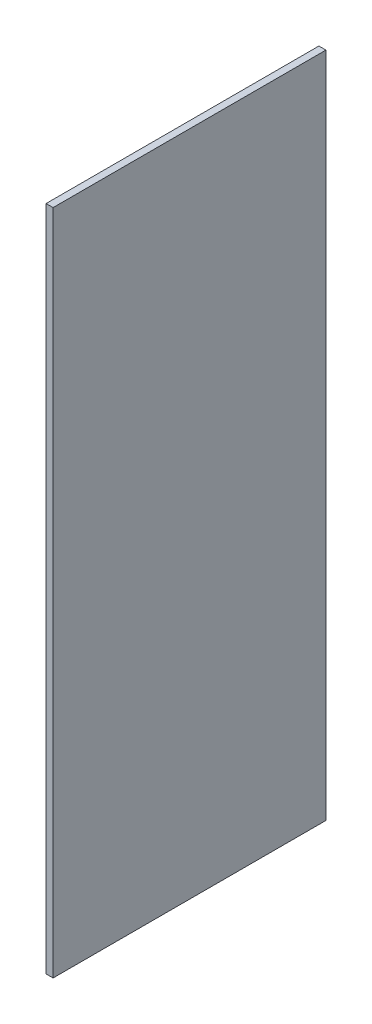
ISO-10303-21;
HEADER;
FILE_DESCRIPTION(('STEP AP214'),'2;1');
FILE_NAME('part.step','',(''),(''),'','','');
FILE_SCHEMA(('AUTOMOTIVE_DESIGN { 1 0 10303 214 1 1 1 1 }'));
ENDSEC;
DATA;
#1=APPLICATION_CONTEXT('core data for automotive mechanical design processes');
#2=APPLICATION_PROTOCOL_DEFINITION('international standard','automotive_design',2000,#1);
#3=PRODUCT_CONTEXT('',#1,'mechanical');
#4=PRODUCT('Part','Part','',(#3));
#5=PRODUCT_RELATED_PRODUCT_CATEGORY('part','',(#4));
#6=PRODUCT_DEFINITION_FORMATION('','',#4);
#7=PRODUCT_DEFINITION_CONTEXT('part definition',#1,'design');
#8=PRODUCT_DEFINITION('design','',#6,#7);
#9=PRODUCT_DEFINITION_SHAPE('','',#8);
#10=(LENGTH_UNIT() NAMED_UNIT(*) SI_UNIT(.MILLI.,.METRE.));
#11=(NAMED_UNIT(*) PLANE_ANGLE_UNIT() SI_UNIT($,.RADIAN.));
#12=(NAMED_UNIT(*) SI_UNIT($,.STERADIAN.) SOLID_ANGLE_UNIT());
#13=UNCERTAINTY_MEASURE_WITH_UNIT(LENGTH_MEASURE(1.E-05),#10,'distance_accuracy_value','');
#14=(GEOMETRIC_REPRESENTATION_CONTEXT(3) GLOBAL_UNCERTAINTY_ASSIGNED_CONTEXT((#13)) GLOBAL_UNIT_ASSIGNED_CONTEXT((#10,
#11,#12)) REPRESENTATION_CONTEXT('',''));
#15=CARTESIAN_POINT('',(0.,0.,0.));
#16=DIRECTION('',(0.,0.,1.));
#17=DIRECTION('',(1.,0.,0.));
#18=AXIS2_PLACEMENT_3D('',#15,#16,#17);
#19=CARTESIAN_POINT('',(1.5,5.85000000000011,3.40000000000003));
#20=DIRECTION('',(0.,-1.,0.));
#21=DIRECTION('',(0.,0.,-1.));
#22=AXIS2_PLACEMENT_3D('',#19,#20,#21);
#23=PLANE('',#22);
#24=DIRECTION('',(0.,0.,1.));
#25=VECTOR('',#24,1.);
#26=CARTESIAN_POINT('',(0.5,5.85000000000011,3.40000000000003));
#27=LINE('',#26,#25);
#28=CARTESIAN_POINT('',(0.5,5.85000000000011,3.40000000000003));
#29=VERTEX_POINT('',#28);
#30=CARTESIAN_POINT('',(0.5,5.85000000000012,42.25));
#31=VERTEX_POINT('',#30);
#32=EDGE_CURVE('E119',#29,#31,#27,.T.);
#33=ORIENTED_EDGE('',*,*,#32,.F.);
#34=DIRECTION('',(-1.,0.,0.));
#35=VECTOR('',#34,1.);
#36=CARTESIAN_POINT('',(1.5,5.85000000000011,3.40000000000003));
#37=LINE('',#36,#35);
#38=CARTESIAN_POINT('',(1.5,5.85000000000011,3.40000000000003));
#39=VERTEX_POINT('',#38);
#40=EDGE_CURVE('E11',#39,#29,#37,.T.);
#41=ORIENTED_EDGE('',*,*,#40,.F.);
#42=DIRECTION('',(0.,0.,1.));
#43=VECTOR('',#42,1.);
#44=CARTESIAN_POINT('',(1.5,5.85000000000011,3.40000000000003));
#45=LINE('',#44,#43);
#46=CARTESIAN_POINT('',(1.5,5.85000000000012,42.25));
#47=VERTEX_POINT('',#46);
#48=EDGE_CURVE('E128',#39,#47,#45,.T.);
#49=ORIENTED_EDGE('',*,*,#48,.T.);
#50=DIRECTION('',(-1.,0.,0.));
#51=VECTOR('',#50,1.);
#52=CARTESIAN_POINT('',(1.5,5.85000000000012,42.25));
#53=LINE('',#52,#51);
#54=EDGE_CURVE('E37',#47,#31,#53,.T.);
#55=ORIENTED_EDGE('',*,*,#54,.T.);
#56=EDGE_LOOP('',(#33,#41,#49,#55));
#57=FACE_BOUND('',#56,.T.);
#58=ADVANCED_FACE('F34',(#57),#23,.T.);
#59=CARTESIAN_POINT('',(1.5,100.85,3.40000000000002));
#60=DIRECTION('',(0.,0.,-1.));
#61=DIRECTION('',(0.,1.,0.));
#62=AXIS2_PLACEMENT_3D('',#59,#60,#61);
#63=PLANE('',#62);
#64=DIRECTION('',(0.,-1.,0.));
#65=VECTOR('',#64,1.);
#66=CARTESIAN_POINT('',(0.5,100.85,3.40000000000002));
#67=LINE('',#66,#65);
#68=CARTESIAN_POINT('',(0.5,100.85,3.40000000000002));
#69=VERTEX_POINT('',#68);
#70=EDGE_CURVE('E132',#69,#29,#67,.T.);
#71=ORIENTED_EDGE('',*,*,#70,.F.);
#72=DIRECTION('',(-1.,0.,0.));
#73=VECTOR('',#72,1.);
#74=CARTESIAN_POINT('',(1.5,100.85,3.40000000000002));
#75=LINE('',#74,#73);
#76=CARTESIAN_POINT('',(1.5,100.85,3.40000000000002));
#77=VERTEX_POINT('',#76);
#78=EDGE_CURVE('E42',#77,#69,#75,.T.);
#79=ORIENTED_EDGE('',*,*,#78,.F.);
#80=DIRECTION('',(0.,-1.,0.));
#81=VECTOR('',#80,1.);
#82=CARTESIAN_POINT('',(1.5,100.85,3.40000000000002));
#83=LINE('',#82,#81);
#84=EDGE_CURVE('E138',#77,#39,#83,.T.);
#85=ORIENTED_EDGE('',*,*,#84,.T.);
#86=ORIENTED_EDGE('',*,*,#40,.T.);
#87=EDGE_LOOP('',(#71,#79,#85,#86));
#88=FACE_BOUND('',#87,.T.);
#89=ADVANCED_FACE('F161',(#88),#63,.T.);
#90=CARTESIAN_POINT('',(1.5,100.85,42.25));
#91=DIRECTION('',(0.,1.,0.));
#92=DIRECTION('',(0.,0.,1.));
#93=AXIS2_PLACEMENT_3D('',#90,#91,#92);
#94=PLANE('',#93);
#95=DIRECTION('',(0.,0.,-1.));
#96=VECTOR('',#95,1.);
#97=CARTESIAN_POINT('',(0.5,100.85,42.25));
#98=LINE('',#97,#96);
#99=CARTESIAN_POINT('',(0.5,100.85,42.25));
#100=VERTEX_POINT('',#99);
#101=EDGE_CURVE('E143',#100,#69,#98,.T.);
#102=ORIENTED_EDGE('',*,*,#101,.F.);
#103=DIRECTION('',(-1.,0.,0.));
#104=VECTOR('',#103,1.);
#105=CARTESIAN_POINT('',(1.5,100.85,42.25));
#106=LINE('',#105,#104);
#107=CARTESIAN_POINT('',(1.5,100.85,42.25));
#108=VERTEX_POINT('',#107);
#109=EDGE_CURVE('E148',#108,#100,#106,.T.);
#110=ORIENTED_EDGE('',*,*,#109,.F.);
#111=DIRECTION('',(0.,0.,-1.));
#112=VECTOR('',#111,1.);
#113=CARTESIAN_POINT('',(1.5,100.85,42.25));
#114=LINE('',#113,#112);
#115=EDGE_CURVE('E135',#108,#77,#114,.T.);
#116=ORIENTED_EDGE('',*,*,#115,.T.);
#117=ORIENTED_EDGE('',*,*,#78,.T.);
#118=EDGE_LOOP('',(#102,#110,#116,#117));
#119=FACE_BOUND('',#118,.T.);
#120=ADVANCED_FACE('F167',(#119),#94,.T.);
#121=CARTESIAN_POINT('',(1.5,5.85000000000012,42.25));
#122=DIRECTION('',(0.,0.,1.));
#123=DIRECTION('',(0.,-1.,0.));
#124=AXIS2_PLACEMENT_3D('',#121,#122,#123);
#125=PLANE('',#124);
#126=DIRECTION('',(0.,1.,0.));
#127=VECTOR('',#126,1.);
#128=CARTESIAN_POINT('',(0.5,5.85000000000012,42.25));
#129=LINE('',#128,#127);
#130=EDGE_CURVE('E122',#31,#100,#129,.T.);
#131=ORIENTED_EDGE('',*,*,#130,.F.);
#132=ORIENTED_EDGE('',*,*,#54,.F.);
#133=DIRECTION('',(0.,1.,0.));
#134=VECTOR('',#133,1.);
#135=CARTESIAN_POINT('',(1.5,5.85000000000012,42.25));
#136=LINE('',#135,#134);
#137=EDGE_CURVE('E131',#47,#108,#136,.T.);
#138=ORIENTED_EDGE('',*,*,#137,.T.);
#139=ORIENTED_EDGE('',*,*,#109,.T.);
#140=EDGE_LOOP('',(#131,#132,#138,#139));
#141=FACE_BOUND('',#140,.T.);
#142=ADVANCED_FACE('F156',(#141),#125,.T.);
#143=CARTESIAN_POINT('',(1.5,0.,0.));
#144=DIRECTION('',(-1.,0.,0.));
#145=DIRECTION('',(0.,0.,1.));
#146=AXIS2_PLACEMENT_3D('',#143,#144,#145);
#147=PLANE('',#146);
#148=ORIENTED_EDGE('',*,*,#48,.F.);
#149=ORIENTED_EDGE('',*,*,#84,.F.);
#150=ORIENTED_EDGE('',*,*,#115,.F.);
#151=ORIENTED_EDGE('',*,*,#137,.F.);
#152=EDGE_LOOP('',(#148,#149,#150,#151));
#153=FACE_BOUND('',#152,.T.);
#154=ADVANCED_FACE('F164',(#153),#147,.F.);
#155=CARTESIAN_POINT('',(0.5,0.,0.));
#156=DIRECTION('',(-1.,0.,0.));
#157=DIRECTION('',(0.,0.,1.));
#158=AXIS2_PLACEMENT_3D('',#155,#156,#157);
#159=PLANE('',#158);
#160=DIRECTION('',(0.,1.,0.));
#161=VECTOR('',#160,1.);
#162=CARTESIAN_POINT('',(0.5,98.1500000000001,39.55));
#163=LINE('',#162,#161);
#164=CARTESIAN_POINT('',(0.5,8.55000000000012,39.55));
#165=VERTEX_POINT('',#164);
#166=CARTESIAN_POINT('',(0.5,98.1500000000001,39.55));
#167=VERTEX_POINT('',#166);
#168=EDGE_CURVE('E50',#165,#167,#163,.T.);
#169=ORIENTED_EDGE('',*,*,#168,.F.);
#170=DIRECTION('',(0.,0.,1.));
#171=VECTOR('',#170,1.);
#172=CARTESIAN_POINT('',(0.5,8.55000000000012,39.55));
#173=LINE('',#172,#171);
#174=CARTESIAN_POINT('',(0.5,8.55000000000011,6.10000000000003));
#175=VERTEX_POINT('',#174);
#176=EDGE_CURVE('E54',#175,#165,#173,.T.);
#177=ORIENTED_EDGE('',*,*,#176,.F.);
#178=DIRECTION('',(0.,-1.,0.));
#179=VECTOR('',#178,1.);
#180=CARTESIAN_POINT('',(0.5,8.55000000000011,6.10000000000003));
#181=LINE('',#180,#179);
#182=CARTESIAN_POINT('',(0.5,98.1500000000001,6.10000000000002));
#183=VERTEX_POINT('',#182);
#184=EDGE_CURVE('E259',#183,#175,#181,.T.);
#185=ORIENTED_EDGE('',*,*,#184,.F.);
#186=DIRECTION('',(0.,0.,-1.));
#187=VECTOR('',#186,1.);
#188=CARTESIAN_POINT('',(0.5,98.1500000000001,6.10000000000002));
#189=LINE('',#188,#187);
#190=EDGE_CURVE('E265',#167,#183,#189,.T.);
#191=ORIENTED_EDGE('',*,*,#190,.F.);
#192=EDGE_LOOP('',(#169,#177,#185,#191));
#193=FACE_BOUND('',#192,.T.);
#194=ORIENTED_EDGE('',*,*,#32,.T.);
#195=ORIENTED_EDGE('',*,*,#130,.T.);
#196=ORIENTED_EDGE('',*,*,#101,.T.);
#197=ORIENTED_EDGE('',*,*,#70,.T.);
#198=EDGE_LOOP('',(#194,#195,#196,#197));
#199=FACE_BOUND('',#198,.T.);
#200=ADVANCED_FACE('F158',(#193,#199),#159,.T.);
#201=CARTESIAN_POINT('',(0.,98.1500000000001,39.55));
#202=DIRECTION('',(0.,0.,-1.));
#203=DIRECTION('',(0.,1.,0.));
#204=AXIS2_PLACEMENT_3D('',#201,#202,#203);
#205=PLANE('',#204);
#206=ORIENTED_EDGE('',*,*,#168,.T.);
#207=DIRECTION('',(1.,0.,0.));
#208=VECTOR('',#207,1.);
#209=CARTESIAN_POINT('',(0.,98.1500000000001,39.55));
#210=LINE('',#209,#208);
#211=CARTESIAN_POINT('',(0.,98.1500000000001,39.55));
#212=VERTEX_POINT('',#211);
#213=EDGE_CURVE('E102',#212,#167,#210,.T.);
#214=ORIENTED_EDGE('',*,*,#213,.F.);
#215=DIRECTION('',(0.,1.,0.));
#216=VECTOR('',#215,1.);
#217=CARTESIAN_POINT('',(0.,98.1500000000001,39.55));
#218=LINE('',#217,#216);
#219=CARTESIAN_POINT('',(0.,8.55000000000012,39.55));
#220=VERTEX_POINT('',#219);
#221=EDGE_CURVE('E108',#220,#212,#218,.T.);
#222=ORIENTED_EDGE('',*,*,#221,.F.);
#223=DIRECTION('',(1.,0.,0.));
#224=VECTOR('',#223,1.);
#225=CARTESIAN_POINT('',(0.,8.55000000000012,39.55));
#226=LINE('',#225,#224);
#227=EDGE_CURVE('E257',#220,#165,#226,.T.);
#228=ORIENTED_EDGE('',*,*,#227,.T.);
#229=EDGE_LOOP('',(#206,#214,#222,#228));
#230=FACE_BOUND('',#229,.T.);
#231=ADVANCED_FACE('F118',(#230),#205,.F.);
#232=CARTESIAN_POINT('',(0.,98.1500000000001,6.10000000000002));
#233=DIRECTION('',(0.,-1.,0.));
#234=DIRECTION('',(0.,0.,-1.));
#235=AXIS2_PLACEMENT_3D('',#232,#233,#234);
#236=PLANE('',#235);
#237=ORIENTED_EDGE('',*,*,#190,.T.);
#238=DIRECTION('',(1.,0.,0.));
#239=VECTOR('',#238,1.);
#240=CARTESIAN_POINT('',(0.,98.1500000000001,6.10000000000002));
#241=LINE('',#240,#239);
#242=CARTESIAN_POINT('',(0.,98.1500000000001,6.10000000000002));
#243=VERTEX_POINT('',#242);
#244=EDGE_CURVE('E104',#243,#183,#241,.T.);
#245=ORIENTED_EDGE('',*,*,#244,.F.);
#246=DIRECTION('',(0.,0.,-1.));
#247=VECTOR('',#246,1.);
#248=CARTESIAN_POINT('',(0.,98.1500000000001,6.10000000000002));
#249=LINE('',#248,#247);
#250=EDGE_CURVE('E97',#212,#243,#249,.T.);
#251=ORIENTED_EDGE('',*,*,#250,.F.);
#252=ORIENTED_EDGE('',*,*,#213,.T.);
#253=EDGE_LOOP('',(#237,#245,#251,#252));
#254=FACE_BOUND('',#253,.T.);
#255=ADVANCED_FACE('F100',(#254),#236,.F.);
#256=CARTESIAN_POINT('',(0.,8.55000000000011,6.10000000000003));
#257=DIRECTION('',(0.,0.,1.));
#258=DIRECTION('',(0.,-1.,0.));
#259=AXIS2_PLACEMENT_3D('',#256,#257,#258);
#260=PLANE('',#259);
#261=ORIENTED_EDGE('',*,*,#184,.T.);
#262=DIRECTION('',(1.,0.,0.));
#263=VECTOR('',#262,1.);
#264=CARTESIAN_POINT('',(0.,8.55000000000011,6.10000000000003));
#265=LINE('',#264,#263);
#266=CARTESIAN_POINT('',(0.,8.55000000000011,6.10000000000003));
#267=VERTEX_POINT('',#266);
#268=EDGE_CURVE('E124',#267,#175,#265,.T.);
#269=ORIENTED_EDGE('',*,*,#268,.F.);
#270=DIRECTION('',(0.,-1.,0.));
#271=VECTOR('',#270,1.);
#272=CARTESIAN_POINT('',(0.,8.55000000000011,6.10000000000003));
#273=LINE('',#272,#271);
#274=EDGE_CURVE('E107',#243,#267,#273,.T.);
#275=ORIENTED_EDGE('',*,*,#274,.F.);
#276=ORIENTED_EDGE('',*,*,#244,.T.);
#277=EDGE_LOOP('',(#261,#269,#275,#276));
#278=FACE_BOUND('',#277,.T.);
#279=ADVANCED_FACE('F225',(#278),#260,.F.);
#280=CARTESIAN_POINT('',(0.,8.55000000000012,39.55));
#281=DIRECTION('',(0.,1.,0.));
#282=DIRECTION('',(0.,0.,1.));
#283=AXIS2_PLACEMENT_3D('',#280,#281,#282);
#284=PLANE('',#283);
#285=ORIENTED_EDGE('',*,*,#176,.T.);
#286=ORIENTED_EDGE('',*,*,#227,.F.);
#287=DIRECTION('',(0.,0.,1.));
#288=VECTOR('',#287,1.);
#289=CARTESIAN_POINT('',(0.,8.55000000000012,39.55));
#290=LINE('',#289,#288);
#291=EDGE_CURVE('E113',#267,#220,#290,.T.);
#292=ORIENTED_EDGE('',*,*,#291,.F.);
#293=ORIENTED_EDGE('',*,*,#268,.T.);
#294=EDGE_LOOP('',(#285,#286,#292,#293));
#295=FACE_BOUND('',#294,.T.);
#296=ADVANCED_FACE('F234',(#295),#284,.F.);
#297=CARTESIAN_POINT('',(0.,0.,0.));
#298=DIRECTION('',(1.,0.,0.));
#299=DIRECTION('',(0.,0.,-1.));
#300=AXIS2_PLACEMENT_3D('',#297,#298,#299);
#301=PLANE('',#300);
#302=ORIENTED_EDGE('',*,*,#221,.T.);
#303=ORIENTED_EDGE('',*,*,#250,.T.);
#304=ORIENTED_EDGE('',*,*,#274,.T.);
#305=ORIENTED_EDGE('',*,*,#291,.T.);
#306=EDGE_LOOP('',(#302,#303,#304,#305));
#307=FACE_BOUND('',#306,.T.);
#308=ADVANCED_FACE('F111',(#307),#301,.F.);
#309=CLOSED_SHELL('',(#58,#89,#120,#142,#154,#200,#231,#255,#279,#296,#308));
#310=MANIFOLD_SOLID_BREP('B2',#309);
#311=ADVANCED_BREP_SHAPE_REPRESENTATION('',(#18,#310),#14);
#312=SHAPE_DEFINITION_REPRESENTATION(#9,#311);
ENDSEC;
END-ISO-10303-21;
